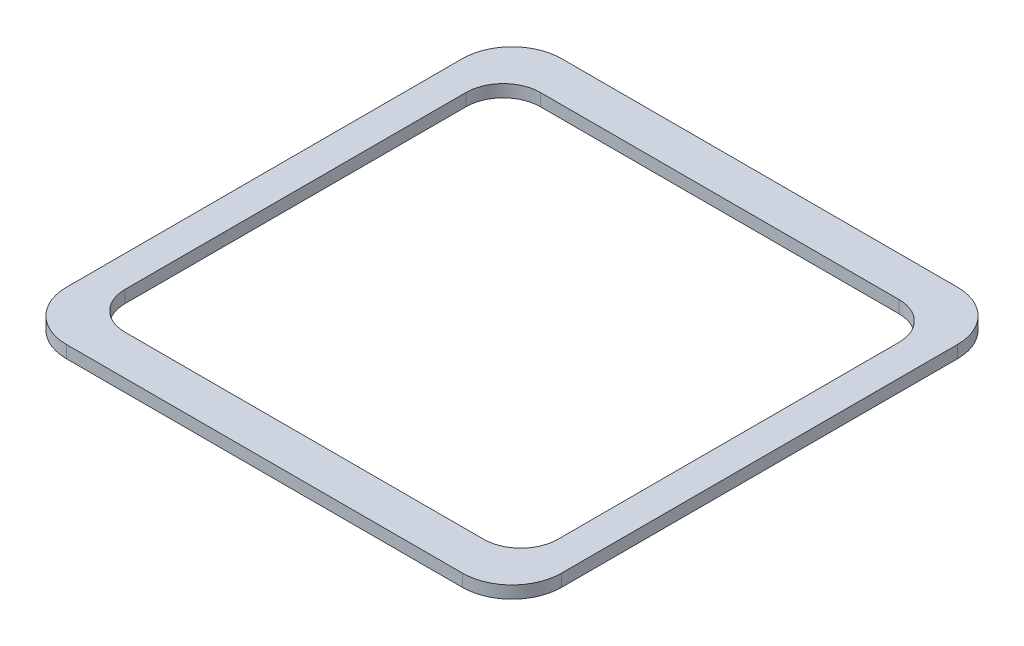
ISO-10303-21;
HEADER;
FILE_DESCRIPTION(('STEP AP214'),'2;1');
FILE_NAME('part.step','',(''),(''),'','','');
FILE_SCHEMA(('AUTOMOTIVE_DESIGN { 1 0 10303 214 1 1 1 1 }'));
ENDSEC;
DATA;
#1=APPLICATION_CONTEXT('core data for automotive mechanical design processes');
#2=APPLICATION_PROTOCOL_DEFINITION('international standard','automotive_design',2000,#1);
#3=PRODUCT_CONTEXT('',#1,'mechanical');
#4=PRODUCT('Part','Part','',(#3));
#5=PRODUCT_RELATED_PRODUCT_CATEGORY('part','',(#4));
#6=PRODUCT_DEFINITION_FORMATION('','',#4);
#7=PRODUCT_DEFINITION_CONTEXT('part definition',#1,'design');
#8=PRODUCT_DEFINITION('design','',#6,#7);
#9=PRODUCT_DEFINITION_SHAPE('','',#8);
#10=(LENGTH_UNIT() NAMED_UNIT(*) SI_UNIT(.MILLI.,.METRE.));
#11=(NAMED_UNIT(*) PLANE_ANGLE_UNIT() SI_UNIT($,.RADIAN.));
#12=(NAMED_UNIT(*) SI_UNIT($,.STERADIAN.) SOLID_ANGLE_UNIT());
#13=UNCERTAINTY_MEASURE_WITH_UNIT(LENGTH_MEASURE(1.E-05),#10,'distance_accuracy_value','');
#14=(GEOMETRIC_REPRESENTATION_CONTEXT(3) GLOBAL_UNCERTAINTY_ASSIGNED_CONTEXT((#13)) GLOBAL_UNIT_ASSIGNED_CONTEXT((#10,
#11,#12)) REPRESENTATION_CONTEXT('',''));
#15=CARTESIAN_POINT('',(0.,0.,0.));
#16=DIRECTION('',(0.,0.,1.));
#17=DIRECTION('',(1.,0.,0.));
#18=AXIS2_PLACEMENT_3D('',#15,#16,#17);
#19=CARTESIAN_POINT('',(36.6124731678103,52.5177384185663,27.6533725174582));
#20=DIRECTION('',(0.,1.,0.));
#21=DIRECTION('',(0.,0.,1.));
#22=AXIS2_PLACEMENT_3D('',#19,#20,#21);
#23=PLANE('',#22);
#24=CARTESIAN_POINT('',(36.6124731678103,52.5177384185663,27.6533725174582));
#25=DIRECTION('',(0.,1.,0.));
#26=DIRECTION('',(0.,0.,1.));
#27=AXIS2_PLACEMENT_3D('',#24,#25,#26);
#28=CIRCLE('',#27,12.7);
#29=CARTESIAN_POINT('',(36.6124731678103,52.5177384185663,40.3533725174583));
#30=VERTEX_POINT('',#29);
#31=CARTESIAN_POINT('',(49.3124731678104,52.5177384185663,27.6533725174583));
#32=VERTEX_POINT('',#31);
#33=EDGE_CURVE('E211',#30,#32,#28,.T.);
#34=ORIENTED_EDGE('',*,*,#33,.T.);
#35=DIRECTION('',(0.,0.,-1.));
#36=VECTOR('',#35,1.);
#37=CARTESIAN_POINT('',(49.3124731678104,52.5177384185663,27.6533725174583));
#38=LINE('',#37,#36);
#39=CARTESIAN_POINT('',(49.3124731678103,52.5177384185663,-73.9466274825418));
#40=VERTEX_POINT('',#39);
#41=EDGE_CURVE('E214',#32,#40,#38,.T.);
#42=ORIENTED_EDGE('',*,*,#41,.T.);
#43=CARTESIAN_POINT('',(36.6124731678103,52.5177384185663,-73.9466274825418));
#44=DIRECTION('',(0.,1.,0.));
#45=DIRECTION('',(0.,0.,1.));
#46=AXIS2_PLACEMENT_3D('',#43,#44,#45);
#47=CIRCLE('',#46,12.7000000000001);
#48=CARTESIAN_POINT('',(36.6124731678103,52.5177384185663,-86.6466274825418));
#49=VERTEX_POINT('',#48);
#50=EDGE_CURVE('E217',#40,#49,#47,.T.);
#51=ORIENTED_EDGE('',*,*,#50,.T.);
#52=DIRECTION('',(-1.,0.,0.));
#53=VECTOR('',#52,1.);
#54=CARTESIAN_POINT('',(36.6124731678103,52.5177384185663,-86.6466274825418));
#55=LINE('',#54,#53);
#56=CARTESIAN_POINT('',(-64.9875268321896,52.5177384185663,-86.6466274825418));
#57=VERTEX_POINT('',#56);
#58=EDGE_CURVE('E219',#49,#57,#55,.T.);
#59=ORIENTED_EDGE('',*,*,#58,.T.);
#60=CARTESIAN_POINT('',(-64.9875268321896,52.5177384185663,-73.9466274825418));
#61=DIRECTION('',(0.,1.,0.));
#62=DIRECTION('',(0.,0.,1.));
#63=AXIS2_PLACEMENT_3D('',#60,#61,#62);
#64=CIRCLE('',#63,12.7);
#65=CARTESIAN_POINT('',(-77.6875268321896,52.5177384185663,-73.9466274825418));
#66=VERTEX_POINT('',#65);
#67=EDGE_CURVE('E221',#57,#66,#64,.T.);
#68=ORIENTED_EDGE('',*,*,#67,.T.);
#69=DIRECTION('',(0.,0.,1.));
#70=VECTOR('',#69,1.);
#71=CARTESIAN_POINT('',(-77.6875268321896,52.5177384185663,-73.9466274825418));
#72=LINE('',#71,#70);
#73=CARTESIAN_POINT('',(-77.6875268321896,52.5177384185663,27.6533725174583));
#74=VERTEX_POINT('',#73);
#75=EDGE_CURVE('E223',#66,#74,#72,.T.);
#76=ORIENTED_EDGE('',*,*,#75,.T.);
#77=CARTESIAN_POINT('',(-64.9875268321896,52.5177384185663,27.6533725174582));
#78=DIRECTION('',(0.,1.,0.));
#79=DIRECTION('',(0.,0.,1.));
#80=AXIS2_PLACEMENT_3D('',#77,#78,#79);
#81=CIRCLE('',#80,12.7);
#82=CARTESIAN_POINT('',(-64.9875268321896,52.5177384185663,40.3533725174582));
#83=VERTEX_POINT('',#82);
#84=EDGE_CURVE('E225',#74,#83,#81,.T.);
#85=ORIENTED_EDGE('',*,*,#84,.T.);
#86=DIRECTION('',(1.,0.,0.));
#87=VECTOR('',#86,1.);
#88=CARTESIAN_POINT('',(-64.9875268321896,52.5177384185663,40.3533725174582));
#89=LINE('',#88,#87);
#90=EDGE_CURVE('E227',#83,#30,#89,.T.);
#91=ORIENTED_EDGE('',*,*,#90,.T.);
#92=EDGE_LOOP('',(#34,#42,#51,#59,#68,#76,#85,#91));
#93=FACE_BOUND('',#92,.T.);
#94=DIRECTION('',(1.,0.,0.));
#95=VECTOR('',#94,1.);
#96=CARTESIAN_POINT('',(-60.1797460388944,52.5177384185663,30.1159025174582));
#97=LINE('',#96,#95);
#98=CARTESIAN_POINT('',(-60.1797460388944,52.5177384185663,30.1159025174582));
#99=VERTEX_POINT('',#98);
#100=CARTESIAN_POINT('',(31.8046923745152,52.5177384185663,30.1159025174582));
#101=VERTEX_POINT('',#100);
#102=EDGE_CURVE('E154',#99,#101,#97,.T.);
#103=ORIENTED_EDGE('',*,*,#102,.F.);
#104=CARTESIAN_POINT('',(-60.1797460388944,52.5177384185663,20.5921725174582));
#105=DIRECTION('',(0.,1.,0.));
#106=DIRECTION('',(0.,0.,1.));
#107=AXIS2_PLACEMENT_3D('',#104,#105,#106);
#108=CIRCLE('',#107,9.52373);
#109=CARTESIAN_POINT('',(-69.7034760388944,52.5177384185663,20.5921725174582));
#110=VERTEX_POINT('',#109);
#111=EDGE_CURVE('E146',#110,#99,#108,.T.);
#112=ORIENTED_EDGE('',*,*,#111,.F.);
#113=DIRECTION('',(0.,0.,1.));
#114=VECTOR('',#113,1.);
#115=CARTESIAN_POINT('',(-69.7034760388944,52.5177384185663,-66.8854274825418));
#116=LINE('',#115,#114);
#117=CARTESIAN_POINT('',(-69.7034760388944,52.5177384185663,-66.8854274825418));
#118=VERTEX_POINT('',#117);
#119=EDGE_CURVE('E179',#118,#110,#116,.T.);
#120=ORIENTED_EDGE('',*,*,#119,.F.);
#121=CARTESIAN_POINT('',(-60.1797460388944,52.5177384185663,-66.8854274825418));
#122=DIRECTION('',(0.,1.,0.));
#123=DIRECTION('',(0.,0.,1.));
#124=AXIS2_PLACEMENT_3D('',#121,#122,#123);
#125=CIRCLE('',#124,9.52372999999999);
#126=CARTESIAN_POINT('',(-60.1797460388944,52.5177384185663,-76.4091574825418));
#127=VERTEX_POINT('',#126);
#128=EDGE_CURVE('E177',#127,#118,#125,.T.);
#129=ORIENTED_EDGE('',*,*,#128,.F.);
#130=DIRECTION('',(-1.,0.,0.));
#131=VECTOR('',#130,1.);
#132=CARTESIAN_POINT('',(31.8046923745152,52.5177384185663,-76.4091574825418));
#133=LINE('',#132,#131);
#134=CARTESIAN_POINT('',(31.8046923745152,52.5177384185663,-76.4091574825418));
#135=VERTEX_POINT('',#134);
#136=EDGE_CURVE('E175',#135,#127,#133,.T.);
#137=ORIENTED_EDGE('',*,*,#136,.F.);
#138=CARTESIAN_POINT('',(31.8046923745152,52.5177384185663,-66.8854274825418));
#139=DIRECTION('',(0.,1.,0.));
#140=DIRECTION('',(0.,0.,1.));
#141=AXIS2_PLACEMENT_3D('',#138,#139,#140);
#142=CIRCLE('',#141,9.52372999999999);
#143=CARTESIAN_POINT('',(41.3284223745152,52.5177384185663,-66.8854274825418));
#144=VERTEX_POINT('',#143);
#145=EDGE_CURVE('E173',#144,#135,#142,.T.);
#146=ORIENTED_EDGE('',*,*,#145,.F.);
#147=DIRECTION('',(0.,0.,-1.));
#148=VECTOR('',#147,1.);
#149=CARTESIAN_POINT('',(41.3284223745152,52.5177384185663,20.5921725174582));
#150=LINE('',#149,#148);
#151=CARTESIAN_POINT('',(41.3284223745152,52.5177384185663,20.5921725174582));
#152=VERTEX_POINT('',#151);
#153=EDGE_CURVE('E169',#152,#144,#150,.T.);
#154=ORIENTED_EDGE('',*,*,#153,.F.);
#155=CARTESIAN_POINT('',(31.8046923745152,52.5177384185663,20.5921725174582));
#156=DIRECTION('',(0.,1.,0.));
#157=DIRECTION('',(0.,0.,1.));
#158=AXIS2_PLACEMENT_3D('',#155,#156,#157);
#159=CIRCLE('',#158,9.52373);
#160=EDGE_CURVE('E167',#101,#152,#159,.T.);
#161=ORIENTED_EDGE('',*,*,#160,.F.);
#162=EDGE_LOOP('',(#103,#112,#120,#129,#137,#146,#154,#161));
#163=FACE_BOUND('',#162,.T.);
#164=ADVANCED_FACE('F33',(#93,#163),#23,.T.);
#165=CARTESIAN_POINT('',(36.6124731678103,49.3427384185663,27.6533725174582));
#166=DIRECTION('',(0.,1.,0.));
#167=DIRECTION('',(0.,0.,1.));
#168=AXIS2_PLACEMENT_3D('',#165,#166,#167);
#169=PLANE('',#168);
#170=CARTESIAN_POINT('',(36.6124731678103,49.3427384185663,27.6533725174582));
#171=DIRECTION('',(0.,1.,0.));
#172=DIRECTION('',(0.,0.,1.));
#173=AXIS2_PLACEMENT_3D('',#170,#171,#172);
#174=CIRCLE('',#173,12.7);
#175=CARTESIAN_POINT('',(36.6124731678103,49.3427384185663,40.3533725174583));
#176=VERTEX_POINT('',#175);
#177=CARTESIAN_POINT('',(49.3124731678104,49.3427384185663,27.6533725174583));
#178=VERTEX_POINT('',#177);
#179=EDGE_CURVE('E162',#176,#178,#174,.T.);
#180=ORIENTED_EDGE('',*,*,#179,.F.);
#181=DIRECTION('',(1.,0.,0.));
#182=VECTOR('',#181,1.);
#183=CARTESIAN_POINT('',(-64.9875268321896,49.3427384185663,40.3533725174582));
#184=LINE('',#183,#182);
#185=CARTESIAN_POINT('',(-64.9875268321896,49.3427384185663,40.3533725174582));
#186=VERTEX_POINT('',#185);
#187=EDGE_CURVE('E215',#186,#176,#184,.T.);
#188=ORIENTED_EDGE('',*,*,#187,.F.);
#189=CARTESIAN_POINT('',(-64.9875268321896,49.3427384185663,27.6533725174582));
#190=DIRECTION('',(0.,1.,0.));
#191=DIRECTION('',(0.,0.,1.));
#192=AXIS2_PLACEMENT_3D('',#189,#190,#191);
#193=CIRCLE('',#192,12.7);
#194=CARTESIAN_POINT('',(-77.6875268321896,49.3427384185663,27.6533725174583));
#195=VERTEX_POINT('',#194);
#196=EDGE_CURVE('E242',#195,#186,#193,.T.);
#197=ORIENTED_EDGE('',*,*,#196,.F.);
#198=DIRECTION('',(0.,0.,1.));
#199=VECTOR('',#198,1.);
#200=CARTESIAN_POINT('',(-77.6875268321896,49.3427384185663,-73.9466274825418));
#201=LINE('',#200,#199);
#202=CARTESIAN_POINT('',(-77.6875268321896,49.3427384185663,-73.9466274825418));
#203=VERTEX_POINT('',#202);
#204=EDGE_CURVE('E240',#203,#195,#201,.T.);
#205=ORIENTED_EDGE('',*,*,#204,.F.);
#206=CARTESIAN_POINT('',(-64.9875268321896,49.3427384185663,-73.9466274825418));
#207=DIRECTION('',(0.,1.,0.));
#208=DIRECTION('',(0.,0.,1.));
#209=AXIS2_PLACEMENT_3D('',#206,#207,#208);
#210=CIRCLE('',#209,12.7);
#211=CARTESIAN_POINT('',(-64.9875268321896,49.3427384185663,-86.6466274825418));
#212=VERTEX_POINT('',#211);
#213=EDGE_CURVE('E238',#212,#203,#210,.T.);
#214=ORIENTED_EDGE('',*,*,#213,.F.);
#215=DIRECTION('',(-1.,0.,0.));
#216=VECTOR('',#215,1.);
#217=CARTESIAN_POINT('',(36.6124731678103,49.3427384185663,-86.6466274825418));
#218=LINE('',#217,#216);
#219=CARTESIAN_POINT('',(36.6124731678103,49.3427384185663,-86.6466274825418));
#220=VERTEX_POINT('',#219);
#221=EDGE_CURVE('E236',#220,#212,#218,.T.);
#222=ORIENTED_EDGE('',*,*,#221,.F.);
#223=CARTESIAN_POINT('',(36.6124731678103,49.3427384185663,-73.9466274825418));
#224=DIRECTION('',(0.,1.,0.));
#225=DIRECTION('',(0.,0.,1.));
#226=AXIS2_PLACEMENT_3D('',#223,#224,#225);
#227=CIRCLE('',#226,12.7000000000001);
#228=CARTESIAN_POINT('',(49.3124731678103,49.3427384185663,-73.9466274825418));
#229=VERTEX_POINT('',#228);
#230=EDGE_CURVE('E234',#229,#220,#227,.T.);
#231=ORIENTED_EDGE('',*,*,#230,.F.);
#232=DIRECTION('',(0.,0.,-1.));
#233=VECTOR('',#232,1.);
#234=CARTESIAN_POINT('',(49.3124731678104,49.3427384185663,27.6533725174583));
#235=LINE('',#234,#233);
#236=EDGE_CURVE('E232',#178,#229,#235,.T.);
#237=ORIENTED_EDGE('',*,*,#236,.F.);
#238=EDGE_LOOP('',(#180,#188,#197,#205,#214,#222,#231,#237));
#239=FACE_BOUND('',#238,.T.);
#240=CARTESIAN_POINT('',(-60.1797460388944,49.3427384185663,20.5921725174582));
#241=DIRECTION('',(0.,1.,0.));
#242=DIRECTION('',(0.,0.,1.));
#243=AXIS2_PLACEMENT_3D('',#240,#241,#242);
#244=CIRCLE('',#243,9.52373);
#245=CARTESIAN_POINT('',(-69.7034760388944,49.3427384185663,20.5921725174582));
#246=VERTEX_POINT('',#245);
#247=CARTESIAN_POINT('',(-60.1797460388944,49.3427384185663,30.1159025174582));
#248=VERTEX_POINT('',#247);
#249=EDGE_CURVE('E56',#246,#248,#244,.T.);
#250=ORIENTED_EDGE('',*,*,#249,.T.);
#251=DIRECTION('',(1.,0.,0.));
#252=VECTOR('',#251,1.);
#253=CARTESIAN_POINT('',(-60.1797460388944,49.3427384185663,30.1159025174582));
#254=LINE('',#253,#252);
#255=CARTESIAN_POINT('',(31.8046923745152,49.3427384185663,30.1159025174582));
#256=VERTEX_POINT('',#255);
#257=EDGE_CURVE('E161',#248,#256,#254,.T.);
#258=ORIENTED_EDGE('',*,*,#257,.T.);
#259=CARTESIAN_POINT('',(31.8046923745152,49.3427384185663,20.5921725174582));
#260=DIRECTION('',(0.,1.,0.));
#261=DIRECTION('',(0.,0.,1.));
#262=AXIS2_PLACEMENT_3D('',#259,#260,#261);
#263=CIRCLE('',#262,9.52373);
#264=CARTESIAN_POINT('',(41.3284223745152,49.3427384185663,20.5921725174582));
#265=VERTEX_POINT('',#264);
#266=EDGE_CURVE('E183',#256,#265,#263,.T.);
#267=ORIENTED_EDGE('',*,*,#266,.T.);
#268=DIRECTION('',(0.,0.,-1.));
#269=VECTOR('',#268,1.);
#270=CARTESIAN_POINT('',(41.3284223745152,49.3427384185663,20.5921725174582));
#271=LINE('',#270,#269);
#272=CARTESIAN_POINT('',(41.3284223745152,49.3427384185663,-66.8854274825418));
#273=VERTEX_POINT('',#272);
#274=EDGE_CURVE('E186',#265,#273,#271,.T.);
#275=ORIENTED_EDGE('',*,*,#274,.T.);
#276=CARTESIAN_POINT('',(31.8046923745152,49.3427384185663,-66.8854274825418));
#277=DIRECTION('',(0.,1.,0.));
#278=DIRECTION('',(0.,0.,1.));
#279=AXIS2_PLACEMENT_3D('',#276,#277,#278);
#280=CIRCLE('',#279,9.52372999999999);
#281=CARTESIAN_POINT('',(31.8046923745152,49.3427384185663,-76.4091574825418));
#282=VERTEX_POINT('',#281);
#283=EDGE_CURVE('E189',#273,#282,#280,.T.);
#284=ORIENTED_EDGE('',*,*,#283,.T.);
#285=DIRECTION('',(-1.,0.,0.));
#286=VECTOR('',#285,1.);
#287=CARTESIAN_POINT('',(31.8046923745152,49.3427384185663,-76.4091574825418));
#288=LINE('',#287,#286);
#289=CARTESIAN_POINT('',(-60.1797460388944,49.3427384185663,-76.4091574825418));
#290=VERTEX_POINT('',#289);
#291=EDGE_CURVE('E192',#282,#290,#288,.T.);
#292=ORIENTED_EDGE('',*,*,#291,.T.);
#293=CARTESIAN_POINT('',(-60.1797460388944,49.3427384185663,-66.8854274825418));
#294=DIRECTION('',(0.,1.,0.));
#295=DIRECTION('',(0.,0.,1.));
#296=AXIS2_PLACEMENT_3D('',#293,#294,#295);
#297=CIRCLE('',#296,9.52372999999999);
#298=CARTESIAN_POINT('',(-69.7034760388944,49.3427384185663,-66.8854274825418));
#299=VERTEX_POINT('',#298);
#300=EDGE_CURVE('E195',#290,#299,#297,.T.);
#301=ORIENTED_EDGE('',*,*,#300,.T.);
#302=DIRECTION('',(0.,0.,1.));
#303=VECTOR('',#302,1.);
#304=CARTESIAN_POINT('',(-69.7034760388944,49.3427384185663,-23.1466274825418));
#305=LINE('',#304,#303);
#306=EDGE_CURVE('E155',#299,#246,#305,.T.);
#307=ORIENTED_EDGE('',*,*,#306,.T.);
#308=EDGE_LOOP('',(#250,#258,#267,#275,#284,#292,#301,#307));
#309=FACE_BOUND('',#308,.T.);
#310=ADVANCED_FACE('F272',(#239,#309),#169,.F.);
#311=CARTESIAN_POINT('',(36.6124731678103,52.5177384185663,27.6533725174582));
#312=DIRECTION('',(0.,-1.,0.));
#313=DIRECTION('',(0.,0.,-1.));
#314=AXIS2_PLACEMENT_3D('',#311,#312,#313);
#315=CYLINDRICAL_SURFACE('',#314,12.7);
#316=ORIENTED_EDGE('',*,*,#179,.T.);
#317=DIRECTION('',(0.,-1.,0.));
#318=VECTOR('',#317,1.);
#319=CARTESIAN_POINT('',(49.3124731678104,52.5177384185663,27.6533725174583));
#320=LINE('',#319,#318);
#321=EDGE_CURVE('E11',#32,#178,#320,.T.);
#322=ORIENTED_EDGE('',*,*,#321,.F.);
#323=ORIENTED_EDGE('',*,*,#33,.F.);
#324=DIRECTION('',(0.,-1.,0.));
#325=VECTOR('',#324,1.);
#326=CARTESIAN_POINT('',(36.6124731678103,52.5177384185663,40.3533725174583));
#327=LINE('',#326,#325);
#328=EDGE_CURVE('E229',#30,#176,#327,.T.);
#329=ORIENTED_EDGE('',*,*,#328,.T.);
#330=EDGE_LOOP('',(#316,#322,#323,#329));
#331=FACE_BOUND('',#330,.T.);
#332=ADVANCED_FACE('F35',(#331),#315,.T.);
#333=CARTESIAN_POINT('',(49.3124731678104,52.5177384185663,27.6533725174583));
#334=DIRECTION('',(-1.,0.,0.));
#335=DIRECTION('',(0.,0.,1.));
#336=AXIS2_PLACEMENT_3D('',#333,#334,#335);
#337=PLANE('',#336);
#338=ORIENTED_EDGE('',*,*,#236,.T.);
#339=DIRECTION('',(0.,-1.,0.));
#340=VECTOR('',#339,1.);
#341=CARTESIAN_POINT('',(49.3124731678103,52.5177384185663,-73.9466274825418));
#342=LINE('',#341,#340);
#343=EDGE_CURVE('E41',#40,#229,#342,.T.);
#344=ORIENTED_EDGE('',*,*,#343,.F.);
#345=ORIENTED_EDGE('',*,*,#41,.F.);
#346=ORIENTED_EDGE('',*,*,#321,.T.);
#347=EDGE_LOOP('',(#338,#344,#345,#346));
#348=FACE_BOUND('',#347,.T.);
#349=ADVANCED_FACE('F289',(#348),#337,.F.);
#350=CARTESIAN_POINT('',(36.6124731678103,52.5177384185663,-73.9466274825418));
#351=DIRECTION('',(0.,-1.,0.));
#352=DIRECTION('',(0.,0.,-1.));
#353=AXIS2_PLACEMENT_3D('',#350,#351,#352);
#354=CYLINDRICAL_SURFACE('',#353,12.7000000000001);
#355=ORIENTED_EDGE('',*,*,#230,.T.);
#356=DIRECTION('',(0.,-1.,0.));
#357=VECTOR('',#356,1.);
#358=CARTESIAN_POINT('',(36.6124731678103,52.5177384185663,-86.6466274825418));
#359=LINE('',#358,#357);
#360=EDGE_CURVE('E259',#49,#220,#359,.T.);
#361=ORIENTED_EDGE('',*,*,#360,.F.);
#362=ORIENTED_EDGE('',*,*,#50,.F.);
#363=ORIENTED_EDGE('',*,*,#343,.T.);
#364=EDGE_LOOP('',(#355,#361,#362,#363));
#365=FACE_BOUND('',#364,.T.);
#366=ADVANCED_FACE('F266',(#365),#354,.T.);
#367=CARTESIAN_POINT('',(36.6124731678103,52.5177384185663,-86.6466274825418));
#368=DIRECTION('',(0.,0.,1.));
#369=DIRECTION('',(1.,0.,0.));
#370=AXIS2_PLACEMENT_3D('',#367,#368,#369);
#371=PLANE('',#370);
#372=ORIENTED_EDGE('',*,*,#221,.T.);
#373=DIRECTION('',(0.,-1.,0.));
#374=VECTOR('',#373,1.);
#375=CARTESIAN_POINT('',(-64.9875268321896,52.5177384185663,-86.6466274825418));
#376=LINE('',#375,#374);
#377=EDGE_CURVE('E256',#57,#212,#376,.T.);
#378=ORIENTED_EDGE('',*,*,#377,.F.);
#379=ORIENTED_EDGE('',*,*,#58,.F.);
#380=ORIENTED_EDGE('',*,*,#360,.T.);
#381=EDGE_LOOP('',(#372,#378,#379,#380));
#382=FACE_BOUND('',#381,.T.);
#383=ADVANCED_FACE('F278',(#382),#371,.F.);
#384=CARTESIAN_POINT('',(-64.9875268321896,52.5177384185663,-73.9466274825418));
#385=DIRECTION('',(0.,-1.,0.));
#386=DIRECTION('',(0.,0.,-1.));
#387=AXIS2_PLACEMENT_3D('',#384,#385,#386);
#388=CYLINDRICAL_SURFACE('',#387,12.7);
#389=ORIENTED_EDGE('',*,*,#213,.T.);
#390=DIRECTION('',(0.,-1.,0.));
#391=VECTOR('',#390,1.);
#392=CARTESIAN_POINT('',(-77.6875268321896,52.5177384185663,-73.9466274825418));
#393=LINE('',#392,#391);
#394=EDGE_CURVE('E253',#66,#203,#393,.T.);
#395=ORIENTED_EDGE('',*,*,#394,.F.);
#396=ORIENTED_EDGE('',*,*,#67,.F.);
#397=ORIENTED_EDGE('',*,*,#377,.T.);
#398=EDGE_LOOP('',(#389,#395,#396,#397));
#399=FACE_BOUND('',#398,.T.);
#400=ADVANCED_FACE('F282',(#399),#388,.T.);
#401=CARTESIAN_POINT('',(-77.6875268321896,52.5177384185663,-73.9466274825418));
#402=DIRECTION('',(1.,0.,0.));
#403=DIRECTION('',(0.,0.,-1.));
#404=AXIS2_PLACEMENT_3D('',#401,#402,#403);
#405=PLANE('',#404);
#406=ORIENTED_EDGE('',*,*,#204,.T.);
#407=DIRECTION('',(0.,-1.,0.));
#408=VECTOR('',#407,1.);
#409=CARTESIAN_POINT('',(-77.6875268321896,52.5177384185663,27.6533725174583));
#410=LINE('',#409,#408);
#411=EDGE_CURVE('E250',#74,#195,#410,.T.);
#412=ORIENTED_EDGE('',*,*,#411,.F.);
#413=ORIENTED_EDGE('',*,*,#75,.F.);
#414=ORIENTED_EDGE('',*,*,#394,.T.);
#415=EDGE_LOOP('',(#406,#412,#413,#414));
#416=FACE_BOUND('',#415,.T.);
#417=ADVANCED_FACE('F302',(#416),#405,.F.);
#418=CARTESIAN_POINT('',(-64.9875268321896,52.5177384185663,27.6533725174582));
#419=DIRECTION('',(0.,-1.,0.));
#420=DIRECTION('',(0.,0.,-1.));
#421=AXIS2_PLACEMENT_3D('',#418,#419,#420);
#422=CYLINDRICAL_SURFACE('',#421,12.7);
#423=ORIENTED_EDGE('',*,*,#196,.T.);
#424=DIRECTION('',(0.,-1.,0.));
#425=VECTOR('',#424,1.);
#426=CARTESIAN_POINT('',(-64.9875268321896,52.5177384185663,40.3533725174582));
#427=LINE('',#426,#425);
#428=EDGE_CURVE('E247',#83,#186,#427,.T.);
#429=ORIENTED_EDGE('',*,*,#428,.F.);
#430=ORIENTED_EDGE('',*,*,#84,.F.);
#431=ORIENTED_EDGE('',*,*,#411,.T.);
#432=EDGE_LOOP('',(#423,#429,#430,#431));
#433=FACE_BOUND('',#432,.T.);
#434=ADVANCED_FACE('F300',(#433),#422,.T.);
#435=CARTESIAN_POINT('',(-64.9875268321896,52.5177384185663,40.3533725174582));
#436=DIRECTION('',(0.,0.,-1.));
#437=DIRECTION('',(-1.,0.,0.));
#438=AXIS2_PLACEMENT_3D('',#435,#436,#437);
#439=PLANE('',#438);
#440=ORIENTED_EDGE('',*,*,#187,.T.);
#441=ORIENTED_EDGE('',*,*,#328,.F.);
#442=ORIENTED_EDGE('',*,*,#90,.F.);
#443=ORIENTED_EDGE('',*,*,#428,.T.);
#444=EDGE_LOOP('',(#440,#441,#442,#443));
#445=FACE_BOUND('',#444,.T.);
#446=ADVANCED_FACE('F295',(#445),#439,.F.);
#447=CARTESIAN_POINT('',(-60.1797460388944,52.5177384185663,20.5921725174582));
#448=DIRECTION('',(0.,-1.,0.));
#449=DIRECTION('',(0.,0.,-1.));
#450=AXIS2_PLACEMENT_3D('',#447,#448,#449);
#451=CYLINDRICAL_SURFACE('',#450,9.52373);
#452=ORIENTED_EDGE('',*,*,#249,.F.);
#453=DIRECTION('',(0.,-1.,0.));
#454=VECTOR('',#453,1.);
#455=CARTESIAN_POINT('',(-69.7034760388944,52.5177384185663,20.5921725174582));
#456=LINE('',#455,#454);
#457=EDGE_CURVE('E150',#110,#246,#456,.T.);
#458=ORIENTED_EDGE('',*,*,#457,.F.);
#459=ORIENTED_EDGE('',*,*,#111,.T.);
#460=DIRECTION('',(0.,-1.,0.));
#461=VECTOR('',#460,1.);
#462=CARTESIAN_POINT('',(-60.1797460388944,52.5177384185663,30.1159025174582));
#463=LINE('',#462,#461);
#464=EDGE_CURVE('E149',#99,#248,#463,.T.);
#465=ORIENTED_EDGE('',*,*,#464,.T.);
#466=EDGE_LOOP('',(#452,#458,#459,#465));
#467=FACE_BOUND('',#466,.T.);
#468=ADVANCED_FACE('F148',(#467),#451,.F.);
#469=CARTESIAN_POINT('',(-60.1797460388944,52.5177384185663,30.1159025174582));
#470=DIRECTION('',(0.,0.,-1.));
#471=DIRECTION('',(-1.,0.,0.));
#472=AXIS2_PLACEMENT_3D('',#469,#470,#471);
#473=PLANE('',#472);
#474=ORIENTED_EDGE('',*,*,#257,.F.);
#475=ORIENTED_EDGE('',*,*,#464,.F.);
#476=ORIENTED_EDGE('',*,*,#102,.T.);
#477=DIRECTION('',(0.,-1.,0.));
#478=VECTOR('',#477,1.);
#479=CARTESIAN_POINT('',(31.8046923745152,52.5177384185663,30.1159025174582));
#480=LINE('',#479,#478);
#481=EDGE_CURVE('E163',#101,#256,#480,.T.);
#482=ORIENTED_EDGE('',*,*,#481,.T.);
#483=EDGE_LOOP('',(#474,#475,#476,#482));
#484=FACE_BOUND('',#483,.T.);
#485=ADVANCED_FACE('F158',(#484),#473,.T.);
#486=CARTESIAN_POINT('',(31.8046923745152,52.5177384185663,20.5921725174582));
#487=DIRECTION('',(0.,-1.,0.));
#488=DIRECTION('',(0.,0.,-1.));
#489=AXIS2_PLACEMENT_3D('',#486,#487,#488);
#490=CYLINDRICAL_SURFACE('',#489,9.52373);
#491=ORIENTED_EDGE('',*,*,#266,.F.);
#492=ORIENTED_EDGE('',*,*,#481,.F.);
#493=ORIENTED_EDGE('',*,*,#160,.T.);
#494=DIRECTION('',(0.,-1.,0.));
#495=VECTOR('',#494,1.);
#496=CARTESIAN_POINT('',(41.3284223745152,52.5177384185663,20.5921725174582));
#497=LINE('',#496,#495);
#498=EDGE_CURVE('E208',#152,#265,#497,.T.);
#499=ORIENTED_EDGE('',*,*,#498,.T.);
#500=EDGE_LOOP('',(#491,#492,#493,#499));
#501=FACE_BOUND('',#500,.T.);
#502=ADVANCED_FACE('F327',(#501),#490,.F.);
#503=CARTESIAN_POINT('',(41.3284223745152,52.5177384185663,20.5921725174582));
#504=DIRECTION('',(-1.,0.,0.));
#505=DIRECTION('',(0.,0.,1.));
#506=AXIS2_PLACEMENT_3D('',#503,#504,#505);
#507=PLANE('',#506);
#508=ORIENTED_EDGE('',*,*,#274,.F.);
#509=ORIENTED_EDGE('',*,*,#498,.F.);
#510=ORIENTED_EDGE('',*,*,#153,.T.);
#511=DIRECTION('',(0.,-1.,0.));
#512=VECTOR('',#511,1.);
#513=CARTESIAN_POINT('',(41.3284223745152,52.5177384185663,-66.8854274825418));
#514=LINE('',#513,#512);
#515=EDGE_CURVE('E206',#144,#273,#514,.T.);
#516=ORIENTED_EDGE('',*,*,#515,.T.);
#517=EDGE_LOOP('',(#508,#509,#510,#516));
#518=FACE_BOUND('',#517,.T.);
#519=ADVANCED_FACE('F331',(#518),#507,.T.);
#520=CARTESIAN_POINT('',(31.8046923745152,52.5177384185663,-66.8854274825418));
#521=DIRECTION('',(0.,-1.,0.));
#522=DIRECTION('',(0.,0.,-1.));
#523=AXIS2_PLACEMENT_3D('',#520,#521,#522);
#524=CYLINDRICAL_SURFACE('',#523,9.52372999999999);
#525=ORIENTED_EDGE('',*,*,#283,.F.);
#526=ORIENTED_EDGE('',*,*,#515,.F.);
#527=ORIENTED_EDGE('',*,*,#145,.T.);
#528=DIRECTION('',(0.,-1.,0.));
#529=VECTOR('',#528,1.);
#530=CARTESIAN_POINT('',(31.8046923745152,52.5177384185663,-76.4091574825418));
#531=LINE('',#530,#529);
#532=EDGE_CURVE('E204',#135,#282,#531,.T.);
#533=ORIENTED_EDGE('',*,*,#532,.T.);
#534=EDGE_LOOP('',(#525,#526,#527,#533));
#535=FACE_BOUND('',#534,.T.);
#536=ADVANCED_FACE('F337',(#535),#524,.F.);
#537=CARTESIAN_POINT('',(31.8046923745152,52.5177384185663,-76.4091574825418));
#538=DIRECTION('',(0.,0.,1.));
#539=DIRECTION('',(1.,0.,0.));
#540=AXIS2_PLACEMENT_3D('',#537,#538,#539);
#541=PLANE('',#540);
#542=ORIENTED_EDGE('',*,*,#291,.F.);
#543=ORIENTED_EDGE('',*,*,#532,.F.);
#544=ORIENTED_EDGE('',*,*,#136,.T.);
#545=DIRECTION('',(0.,-1.,0.));
#546=VECTOR('',#545,1.);
#547=CARTESIAN_POINT('',(-60.1797460388944,52.5177384185663,-76.4091574825418));
#548=LINE('',#547,#546);
#549=EDGE_CURVE('E202',#127,#290,#548,.T.);
#550=ORIENTED_EDGE('',*,*,#549,.T.);
#551=EDGE_LOOP('',(#542,#543,#544,#550));
#552=FACE_BOUND('',#551,.T.);
#553=ADVANCED_FACE('F341',(#552),#541,.T.);
#554=CARTESIAN_POINT('',(-60.1797460388944,52.5177384185663,-66.8854274825418));
#555=DIRECTION('',(0.,-1.,0.));
#556=DIRECTION('',(0.,0.,-1.));
#557=AXIS2_PLACEMENT_3D('',#554,#555,#556);
#558=CYLINDRICAL_SURFACE('',#557,9.52372999999999);
#559=ORIENTED_EDGE('',*,*,#300,.F.);
#560=ORIENTED_EDGE('',*,*,#549,.F.);
#561=ORIENTED_EDGE('',*,*,#128,.T.);
#562=DIRECTION('',(0.,-1.,0.));
#563=VECTOR('',#562,1.);
#564=CARTESIAN_POINT('',(-69.7034760388944,52.5177384185663,-66.8854274825418));
#565=LINE('',#564,#563);
#566=EDGE_CURVE('E48',#118,#299,#565,.T.);
#567=ORIENTED_EDGE('',*,*,#566,.T.);
#568=EDGE_LOOP('',(#559,#560,#561,#567));
#569=FACE_BOUND('',#568,.T.);
#570=ADVANCED_FACE('F345',(#569),#558,.F.);
#571=CARTESIAN_POINT('',(-69.7034760388944,52.5177384185663,-23.1466274825418));
#572=DIRECTION('',(1.,0.,0.));
#573=DIRECTION('',(0.,0.,-1.));
#574=AXIS2_PLACEMENT_3D('',#571,#572,#573);
#575=PLANE('',#574);
#576=ORIENTED_EDGE('',*,*,#306,.F.);
#577=ORIENTED_EDGE('',*,*,#566,.F.);
#578=ORIENTED_EDGE('',*,*,#119,.T.);
#579=ORIENTED_EDGE('',*,*,#457,.T.);
#580=EDGE_LOOP('',(#576,#577,#578,#579));
#581=FACE_BOUND('',#580,.T.);
#582=ADVANCED_FACE('F349',(#581),#575,.T.);
#583=CLOSED_SHELL('',(#164,#310,#332,#349,#366,#383,#400,#417,#434,#446,#468,#485,#502,#519,
#536,#553,#570,#582));
#584=MANIFOLD_SOLID_BREP('B2',#583);
#585=ADVANCED_BREP_SHAPE_REPRESENTATION('',(#18,#584),#14);
#586=SHAPE_DEFINITION_REPRESENTATION(#9,#585);
ENDSEC;
END-ISO-10303-21;
